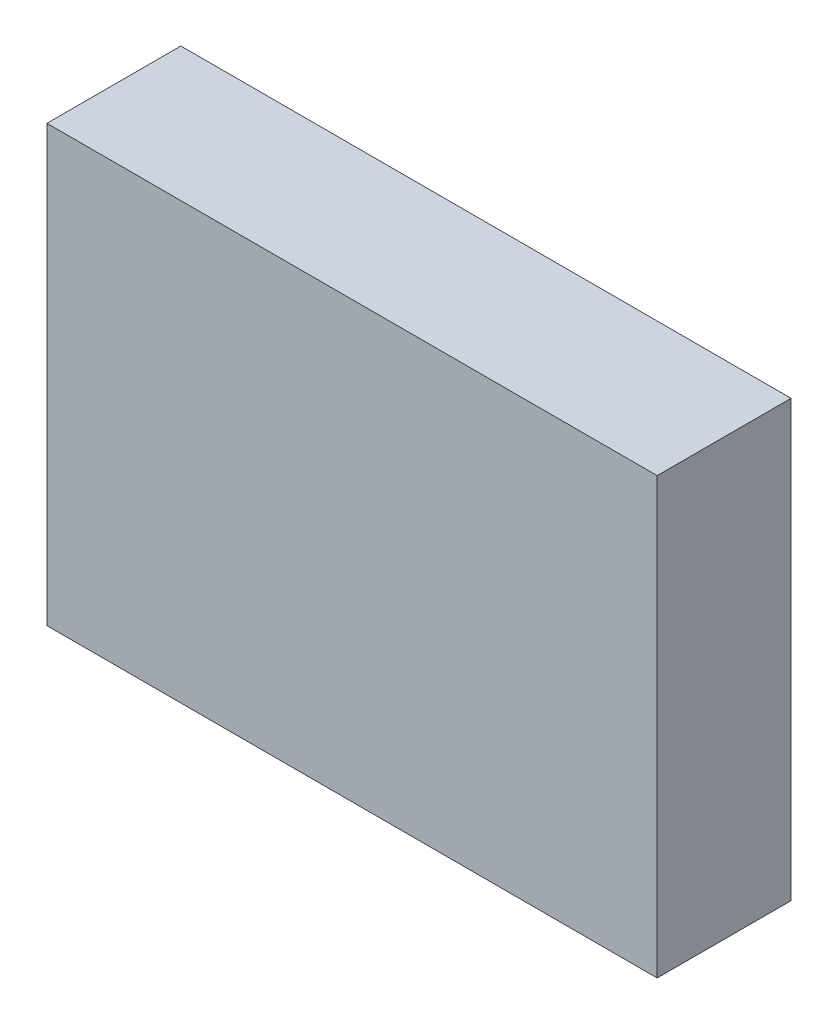
ISO-10303-21;
HEADER;
FILE_DESCRIPTION(('STEP AP214'),'2;1');
FILE_NAME('part.step','',(''),(''),'','','');
FILE_SCHEMA(('AUTOMOTIVE_DESIGN { 1 0 10303 214 1 1 1 1 }'));
ENDSEC;
DATA;
#1=APPLICATION_CONTEXT('core data for automotive mechanical design processes');
#2=APPLICATION_PROTOCOL_DEFINITION('international standard','automotive_design',2000,#1);
#3=PRODUCT_CONTEXT('',#1,'mechanical');
#4=PRODUCT('Part','Part','',(#3));
#5=PRODUCT_RELATED_PRODUCT_CATEGORY('part','',(#4));
#6=PRODUCT_DEFINITION_FORMATION('','',#4);
#7=PRODUCT_DEFINITION_CONTEXT('part definition',#1,'design');
#8=PRODUCT_DEFINITION('design','',#6,#7);
#9=PRODUCT_DEFINITION_SHAPE('','',#8);
#10=(LENGTH_UNIT() NAMED_UNIT(*) SI_UNIT(.MILLI.,.METRE.));
#11=(NAMED_UNIT(*) PLANE_ANGLE_UNIT() SI_UNIT($,.RADIAN.));
#12=(NAMED_UNIT(*) SI_UNIT($,.STERADIAN.) SOLID_ANGLE_UNIT());
#13=UNCERTAINTY_MEASURE_WITH_UNIT(LENGTH_MEASURE(1.E-05),#10,'distance_accuracy_value','');
#14=(GEOMETRIC_REPRESENTATION_CONTEXT(3) GLOBAL_UNCERTAINTY_ASSIGNED_CONTEXT((#13)) GLOBAL_UNIT_ASSIGNED_CONTEXT((#10,
#11,#12)) REPRESENTATION_CONTEXT('',''));
#15=CARTESIAN_POINT('',(0.,0.,0.));
#16=DIRECTION('',(0.,0.,1.));
#17=DIRECTION('',(1.,0.,0.));
#18=AXIS2_PLACEMENT_3D('',#15,#16,#17);
#19=CARTESIAN_POINT('',(80.3934069529006,-22.5007862774631,5.));
#20=DIRECTION('',(1.,0.,0.));
#21=DIRECTION('',(0.,0.,-1.));
#22=AXIS2_PLACEMENT_3D('',#19,#20,#21);
#23=PLANE('',#22);
#24=DIRECTION('',(0.,-1.,0.));
#25=VECTOR('',#24,1.);
#26=CARTESIAN_POINT('',(80.3934069529006,-22.5007862774631,0.));
#27=LINE('',#26,#25);
#28=CARTESIAN_POINT('',(80.3934069529006,-22.5007862774631,0.));
#29=VERTEX_POINT('',#28);
#30=CARTESIAN_POINT('',(80.3934069529006,-38.7473377614266,0.));
#31=VERTEX_POINT('',#30);
#32=EDGE_CURVE('E102',#29,#31,#27,.T.);
#33=ORIENTED_EDGE('',*,*,#32,.T.);
#34=DIRECTION('',(0.,0.,-1.));
#35=VECTOR('',#34,1.);
#36=CARTESIAN_POINT('',(80.3934069529006,-38.7473377614266,5.));
#37=LINE('',#36,#35);
#38=CARTESIAN_POINT('',(80.3934069529006,-38.7473377614266,5.));
#39=VERTEX_POINT('',#38);
#40=EDGE_CURVE('E11',#39,#31,#37,.T.);
#41=ORIENTED_EDGE('',*,*,#40,.F.);
#42=DIRECTION('',(0.,-1.,0.));
#43=VECTOR('',#42,1.);
#44=CARTESIAN_POINT('',(80.3934069529006,-22.5007862774631,5.));
#45=LINE('',#44,#43);
#46=CARTESIAN_POINT('',(80.3934069529006,-22.5007862774631,5.));
#47=VERTEX_POINT('',#46);
#48=EDGE_CURVE('E90',#47,#39,#45,.T.);
#49=ORIENTED_EDGE('',*,*,#48,.F.);
#50=DIRECTION('',(0.,0.,-1.));
#51=VECTOR('',#50,1.);
#52=CARTESIAN_POINT('',(80.3934069529006,-22.5007862774631,5.));
#53=LINE('',#52,#51);
#54=EDGE_CURVE('E98',#47,#29,#53,.T.);
#55=ORIENTED_EDGE('',*,*,#54,.T.);
#56=EDGE_LOOP('',(#33,#41,#49,#55));
#57=FACE_BOUND('',#56,.T.);
#58=ADVANCED_FACE('F39',(#57),#23,.F.);
#59=CARTESIAN_POINT('',(80.3934069529006,-38.7473377614266,5.));
#60=DIRECTION('',(0.,1.,0.));
#61=DIRECTION('',(0.,0.,1.));
#62=AXIS2_PLACEMENT_3D('',#59,#60,#61);
#63=PLANE('',#62);
#64=DIRECTION('',(1.,0.,0.));
#65=VECTOR('',#64,1.);
#66=CARTESIAN_POINT('',(80.3934069529006,-38.7473377614266,0.));
#67=LINE('',#66,#65);
#68=CARTESIAN_POINT('',(103.180777865473,-38.7473377614266,0.));
#69=VERTEX_POINT('',#68);
#70=EDGE_CURVE('E94',#31,#69,#67,.T.);
#71=ORIENTED_EDGE('',*,*,#70,.T.);
#72=DIRECTION('',(0.,0.,-1.));
#73=VECTOR('',#72,1.);
#74=CARTESIAN_POINT('',(103.180777865473,-38.7473377614266,5.));
#75=LINE('',#74,#73);
#76=CARTESIAN_POINT('',(103.180777865473,-38.7473377614266,5.));
#77=VERTEX_POINT('',#76);
#78=EDGE_CURVE('E47',#77,#69,#75,.T.);
#79=ORIENTED_EDGE('',*,*,#78,.F.);
#80=DIRECTION('',(1.,0.,0.));
#81=VECTOR('',#80,1.);
#82=CARTESIAN_POINT('',(80.3934069529006,-38.7473377614266,5.));
#83=LINE('',#82,#81);
#84=EDGE_CURVE('E85',#39,#77,#83,.T.);
#85=ORIENTED_EDGE('',*,*,#84,.F.);
#86=ORIENTED_EDGE('',*,*,#40,.T.);
#87=EDGE_LOOP('',(#71,#79,#85,#86));
#88=FACE_BOUND('',#87,.T.);
#89=ADVANCED_FACE('F93',(#88),#63,.F.);
#90=CARTESIAN_POINT('',(103.180777865473,-22.5007862774631,5.));
#91=DIRECTION('',(-1.,0.,0.));
#92=DIRECTION('',(0.,0.,1.));
#93=AXIS2_PLACEMENT_3D('',#90,#91,#92);
#94=PLANE('',#93);
#95=DIRECTION('',(0.,1.,0.));
#96=VECTOR('',#95,1.);
#97=CARTESIAN_POINT('',(103.180777865473,-22.5007862774631,0.));
#98=LINE('',#97,#96);
#99=CARTESIAN_POINT('',(103.180777865473,-22.5007862774631,0.));
#100=VERTEX_POINT('',#99);
#101=EDGE_CURVE('E72',#69,#100,#98,.T.);
#102=ORIENTED_EDGE('',*,*,#101,.T.);
#103=DIRECTION('',(0.,0.,-1.));
#104=VECTOR('',#103,1.);
#105=CARTESIAN_POINT('',(103.180777865473,-22.5007862774631,5.));
#106=LINE('',#105,#104);
#107=CARTESIAN_POINT('',(103.180777865473,-22.5007862774631,5.));
#108=VERTEX_POINT('',#107);
#109=EDGE_CURVE('E95',#108,#100,#106,.T.);
#110=ORIENTED_EDGE('',*,*,#109,.F.);
#111=DIRECTION('',(0.,1.,0.));
#112=VECTOR('',#111,1.);
#113=CARTESIAN_POINT('',(103.180777865473,-22.5007862774631,5.));
#114=LINE('',#113,#112);
#115=EDGE_CURVE('E88',#77,#108,#114,.T.);
#116=ORIENTED_EDGE('',*,*,#115,.F.);
#117=ORIENTED_EDGE('',*,*,#78,.T.);
#118=EDGE_LOOP('',(#102,#110,#116,#117));
#119=FACE_BOUND('',#118,.T.);
#120=ADVANCED_FACE('F96',(#119),#94,.F.);
#121=CARTESIAN_POINT('',(80.3934069529006,-22.5007862774631,5.));
#122=DIRECTION('',(0.,-1.,0.));
#123=DIRECTION('',(0.,0.,-1.));
#124=AXIS2_PLACEMENT_3D('',#121,#122,#123);
#125=PLANE('',#124);
#126=DIRECTION('',(-1.,0.,0.));
#127=VECTOR('',#126,1.);
#128=CARTESIAN_POINT('',(80.3934069529006,-22.5007862774631,0.));
#129=LINE('',#128,#127);
#130=EDGE_CURVE('E78',#100,#29,#129,.T.);
#131=ORIENTED_EDGE('',*,*,#130,.T.);
#132=ORIENTED_EDGE('',*,*,#54,.F.);
#133=DIRECTION('',(-1.,0.,0.));
#134=VECTOR('',#133,1.);
#135=CARTESIAN_POINT('',(80.3934069529006,-22.5007862774631,5.));
#136=LINE('',#135,#134);
#137=EDGE_CURVE('E55',#108,#47,#136,.T.);
#138=ORIENTED_EDGE('',*,*,#137,.F.);
#139=ORIENTED_EDGE('',*,*,#109,.T.);
#140=EDGE_LOOP('',(#131,#132,#138,#139));
#141=FACE_BOUND('',#140,.T.);
#142=ADVANCED_FACE('F109',(#141),#125,.F.);
#143=CARTESIAN_POINT('',(0.,0.,5.));
#144=DIRECTION('',(0.,0.,1.));
#145=DIRECTION('',(1.,0.,0.));
#146=AXIS2_PLACEMENT_3D('',#143,#144,#145);
#147=PLANE('',#146);
#148=ORIENTED_EDGE('',*,*,#48,.T.);
#149=ORIENTED_EDGE('',*,*,#84,.T.);
#150=ORIENTED_EDGE('',*,*,#115,.T.);
#151=ORIENTED_EDGE('',*,*,#137,.T.);
#152=EDGE_LOOP('',(#148,#149,#150,#151));
#153=FACE_BOUND('',#152,.T.);
#154=ADVANCED_FACE('F86',(#153),#147,.T.);
#155=CARTESIAN_POINT('',(0.,0.,0.));
#156=DIRECTION('',(0.,0.,1.));
#157=DIRECTION('',(1.,0.,0.));
#158=AXIS2_PLACEMENT_3D('',#155,#156,#157);
#159=PLANE('',#158);
#160=ORIENTED_EDGE('',*,*,#32,.F.);
#161=ORIENTED_EDGE('',*,*,#130,.F.);
#162=ORIENTED_EDGE('',*,*,#101,.F.);
#163=ORIENTED_EDGE('',*,*,#70,.F.);
#164=EDGE_LOOP('',(#160,#161,#162,#163));
#165=FACE_BOUND('',#164,.T.);
#166=ADVANCED_FACE('F112',(#165),#159,.F.);
#167=CLOSED_SHELL('',(#58,#89,#120,#142,#154,#166));
#168=MANIFOLD_SOLID_BREP('B2',#167);
#169=ADVANCED_BREP_SHAPE_REPRESENTATION('',(#18,#168),#14);
#170=SHAPE_DEFINITION_REPRESENTATION(#9,#169);
ENDSEC;
END-ISO-10303-21;
